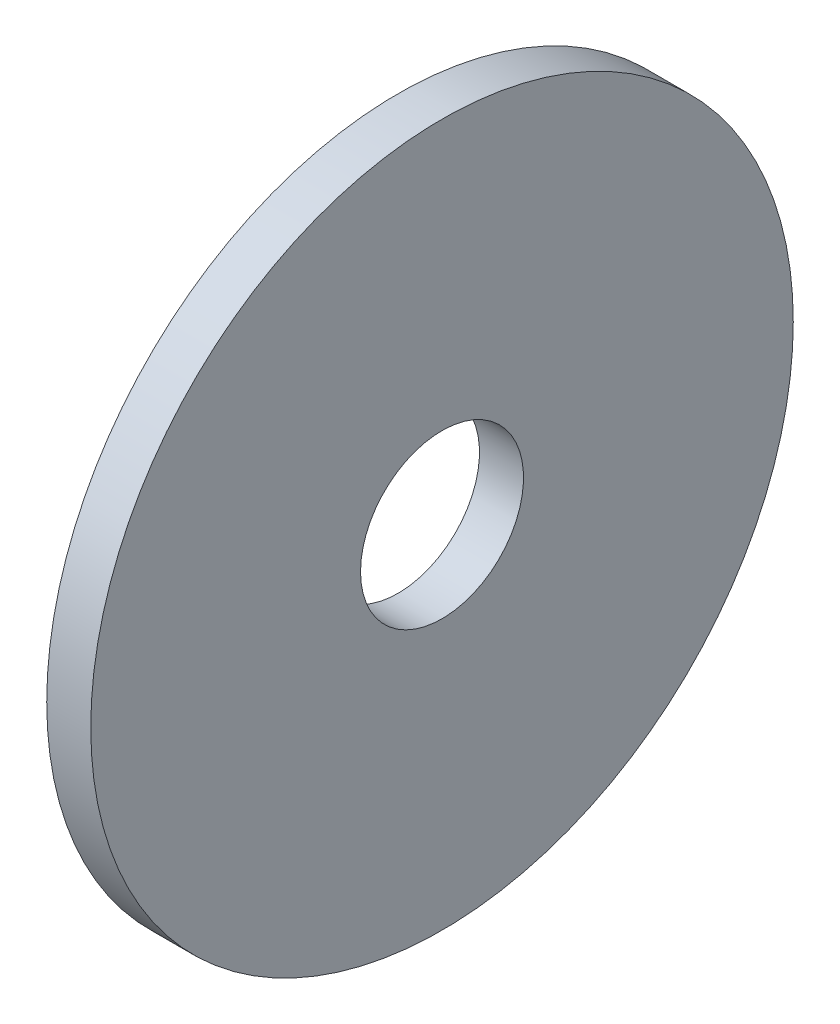
ISO-10303-21;
HEADER;
FILE_DESCRIPTION(('STEP AP214'),'2;1');
FILE_NAME('part.step','',(''),(''),'','','');
FILE_SCHEMA(('AUTOMOTIVE_DESIGN { 1 0 10303 214 1 1 1 1 }'));
ENDSEC;
DATA;
#1=APPLICATION_CONTEXT('core data for automotive mechanical design processes');
#2=APPLICATION_PROTOCOL_DEFINITION('international standard','automotive_design',2000,#1);
#3=PRODUCT_CONTEXT('',#1,'mechanical');
#4=PRODUCT('Part','Part','',(#3));
#5=PRODUCT_RELATED_PRODUCT_CATEGORY('part','',(#4));
#6=PRODUCT_DEFINITION_FORMATION('','',#4);
#7=PRODUCT_DEFINITION_CONTEXT('part definition',#1,'design');
#8=PRODUCT_DEFINITION('design','',#6,#7);
#9=PRODUCT_DEFINITION_SHAPE('','',#8);
#10=(LENGTH_UNIT() NAMED_UNIT(*) SI_UNIT(.MILLI.,.METRE.));
#11=(NAMED_UNIT(*) PLANE_ANGLE_UNIT() SI_UNIT($,.RADIAN.));
#12=(NAMED_UNIT(*) SI_UNIT($,.STERADIAN.) SOLID_ANGLE_UNIT());
#13=UNCERTAINTY_MEASURE_WITH_UNIT(LENGTH_MEASURE(1.E-05),#10,'distance_accuracy_value','');
#14=(GEOMETRIC_REPRESENTATION_CONTEXT(3) GLOBAL_UNCERTAINTY_ASSIGNED_CONTEXT((#13)) GLOBAL_UNIT_ASSIGNED_CONTEXT((#10,
#11,#12)) REPRESENTATION_CONTEXT('',''));
#15=CARTESIAN_POINT('',(0.,0.,0.));
#16=DIRECTION('',(0.,0.,1.));
#17=DIRECTION('',(1.,0.,0.));
#18=AXIS2_PLACEMENT_3D('',#15,#16,#17);
#19=CARTESIAN_POINT('',(1.1938,0.,0.));
#20=DIRECTION('',(1.,0.,0.));
#21=DIRECTION('',(0.,0.,-1.));
#22=AXIS2_PLACEMENT_3D('',#19,#20,#21);
#23=PLANE('',#22);
#24=CARTESIAN_POINT('',(1.1938,0.,0.));
#25=DIRECTION('',(-1.,0.,0.));
#26=DIRECTION('',(0.,0.,1.));
#27=AXIS2_PLACEMENT_3D('',#24,#25,#26);
#28=CIRCLE('',#27,2.2098);
#29=CARTESIAN_POINT('',(1.1938,0.,2.2098));
#30=VERTEX_POINT('',#29);
#31=EDGE_CURVE('E26',#30,#30,#28,.T.);
#32=ORIENTED_EDGE('',*,*,#31,.T.);
#33=EDGE_LOOP('',(#32));
#34=FACE_BOUND('',#33,.T.);
#35=CARTESIAN_POINT('',(1.1938,0.,0.));
#36=DIRECTION('',(-1.,0.,0.));
#37=DIRECTION('',(0.,0.,1.));
#38=AXIS2_PLACEMENT_3D('',#35,#36,#37);
#39=CIRCLE('',#38,9.525);
#40=CARTESIAN_POINT('',(1.1938,0.,9.525));
#41=VERTEX_POINT('',#40);
#42=EDGE_CURVE('E17',#41,#41,#39,.T.);
#43=ORIENTED_EDGE('',*,*,#42,.F.);
#44=EDGE_LOOP('',(#43));
#45=FACE_BOUND('',#44,.T.);
#46=ADVANCED_FACE('F14',(#34,#45),#23,.T.);
#47=CARTESIAN_POINT('',(1.1938,0.,0.));
#48=DIRECTION('',(-1.,0.,0.));
#49=DIRECTION('',(0.,0.,1.));
#50=AXIS2_PLACEMENT_3D('',#47,#48,#49);
#51=CYLINDRICAL_SURFACE('',#50,9.525);
#52=CARTESIAN_POINT('',(0.,0.,0.));
#53=DIRECTION('',(-1.,0.,0.));
#54=DIRECTION('',(0.,0.,1.));
#55=AXIS2_PLACEMENT_3D('',#52,#53,#54);
#56=CIRCLE('',#55,9.525);
#57=CARTESIAN_POINT('',(0.,0.,9.525));
#58=VERTEX_POINT('',#57);
#59=EDGE_CURVE('E21',#58,#58,#56,.F.);
#60=ORIENTED_EDGE('',*,*,#59,.T.);
#61=EDGE_LOOP('',(#60));
#62=FACE_BOUND('',#61,.T.);
#63=ORIENTED_EDGE('',*,*,#42,.T.);
#64=EDGE_LOOP('',(#63));
#65=FACE_BOUND('',#64,.T.);
#66=ADVANCED_FACE('F34',(#62,#65),#51,.T.);
#67=CARTESIAN_POINT('',(1.1938,0.,0.));
#68=DIRECTION('',(-1.,0.,0.));
#69=DIRECTION('',(0.,0.,1.));
#70=AXIS2_PLACEMENT_3D('',#67,#68,#69);
#71=CYLINDRICAL_SURFACE('',#70,2.2098);
#72=CARTESIAN_POINT('',(0.,0.,0.));
#73=DIRECTION('',(-1.,0.,0.));
#74=DIRECTION('',(0.,0.,1.));
#75=AXIS2_PLACEMENT_3D('',#72,#73,#74);
#76=CIRCLE('',#75,2.2098);
#77=CARTESIAN_POINT('',(0.,0.,2.2098));
#78=VERTEX_POINT('',#77);
#79=EDGE_CURVE('E10',#78,#78,#76,.T.);
#80=ORIENTED_EDGE('',*,*,#79,.T.);
#81=EDGE_LOOP('',(#80));
#82=FACE_BOUND('',#81,.T.);
#83=ORIENTED_EDGE('',*,*,#31,.F.);
#84=EDGE_LOOP('',(#83));
#85=FACE_BOUND('',#84,.T.);
#86=ADVANCED_FACE('F41',(#82,#85),#71,.F.);
#87=CARTESIAN_POINT('',(0.,0.,0.));
#88=DIRECTION('',(1.,0.,0.));
#89=DIRECTION('',(0.,0.,-1.));
#90=AXIS2_PLACEMENT_3D('',#87,#88,#89);
#91=PLANE('',#90);
#92=ORIENTED_EDGE('',*,*,#79,.F.);
#93=EDGE_LOOP('',(#92));
#94=FACE_BOUND('',#93,.T.);
#95=ORIENTED_EDGE('',*,*,#59,.F.);
#96=EDGE_LOOP('',(#95));
#97=FACE_BOUND('',#96,.T.);
#98=ADVANCED_FACE('F43',(#94,#97),#91,.F.);
#99=CLOSED_SHELL('',(#46,#66,#86,#98));
#100=MANIFOLD_SOLID_BREP('B1',#99);
#101=ADVANCED_BREP_SHAPE_REPRESENTATION('',(#18,#100),#14);
#102=SHAPE_DEFINITION_REPRESENTATION(#9,#101);
ENDSEC;
END-ISO-10303-21;
